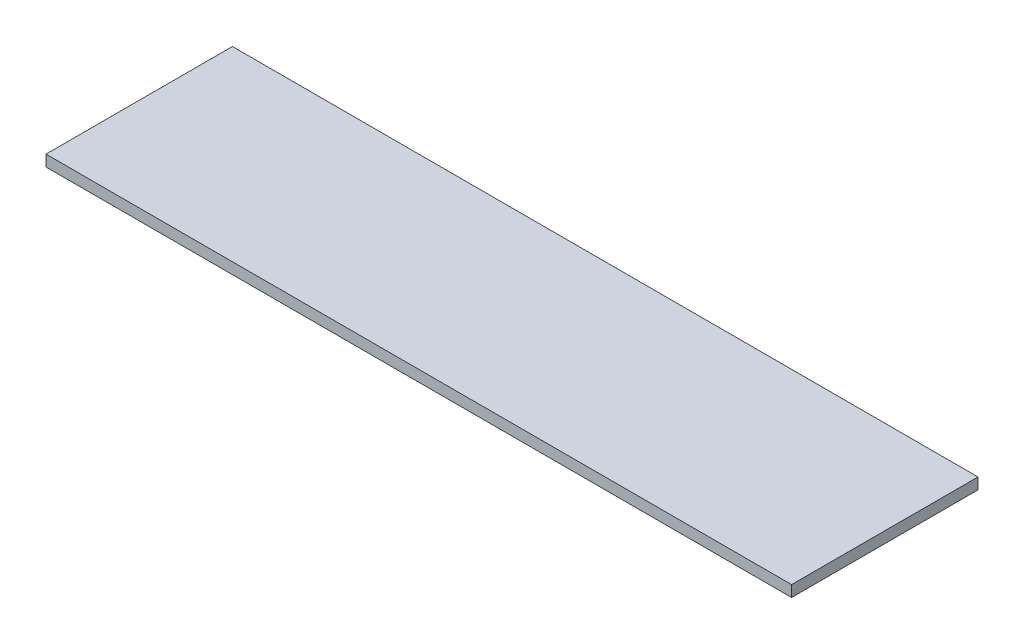
ISO-10303-21;
HEADER;
FILE_DESCRIPTION(('STEP AP214'),'2;1');
FILE_NAME('part.step','',(''),(''),'','','');
FILE_SCHEMA(('AUTOMOTIVE_DESIGN { 1 0 10303 214 1 1 1 1 }'));
ENDSEC;
DATA;
#1=APPLICATION_CONTEXT('core data for automotive mechanical design processes');
#2=APPLICATION_PROTOCOL_DEFINITION('international standard','automotive_design',2000,#1);
#3=PRODUCT_CONTEXT('',#1,'mechanical');
#4=PRODUCT('Part','Part','',(#3));
#5=PRODUCT_RELATED_PRODUCT_CATEGORY('part','',(#4));
#6=PRODUCT_DEFINITION_FORMATION('','',#4);
#7=PRODUCT_DEFINITION_CONTEXT('part definition',#1,'design');
#8=PRODUCT_DEFINITION('design','',#6,#7);
#9=PRODUCT_DEFINITION_SHAPE('','',#8);
#10=(LENGTH_UNIT() NAMED_UNIT(*) SI_UNIT(.MILLI.,.METRE.));
#11=(NAMED_UNIT(*) PLANE_ANGLE_UNIT() SI_UNIT($,.RADIAN.));
#12=(NAMED_UNIT(*) SI_UNIT($,.STERADIAN.) SOLID_ANGLE_UNIT());
#13=UNCERTAINTY_MEASURE_WITH_UNIT(LENGTH_MEASURE(1.E-05),#10,'distance_accuracy_value','');
#14=(GEOMETRIC_REPRESENTATION_CONTEXT(3) GLOBAL_UNCERTAINTY_ASSIGNED_CONTEXT((#13)) GLOBAL_UNIT_ASSIGNED_CONTEXT((#10,
#11,#12)) REPRESENTATION_CONTEXT('',''));
#15=CARTESIAN_POINT('',(0.,0.,0.));
#16=DIRECTION('',(0.,0.,1.));
#17=DIRECTION('',(1.,0.,0.));
#18=AXIS2_PLACEMENT_3D('',#15,#16,#17);
#19=CARTESIAN_POINT('',(100.,3.,-25.));
#20=DIRECTION('',(-1.,0.,0.));
#21=DIRECTION('',(0.,0.,1.));
#22=AXIS2_PLACEMENT_3D('',#19,#20,#21);
#23=PLANE('',#22);
#24=DIRECTION('',(0.,0.,-1.));
#25=VECTOR('',#24,1.);
#26=CARTESIAN_POINT('',(100.,0.,-25.));
#27=LINE('',#26,#25);
#28=CARTESIAN_POINT('',(100.,0.,25.));
#29=VERTEX_POINT('',#28);
#30=CARTESIAN_POINT('',(100.,0.,-25.));
#31=VERTEX_POINT('',#30);
#32=EDGE_CURVE('E107',#29,#31,#27,.T.);
#33=ORIENTED_EDGE('',*,*,#32,.T.);
#34=DIRECTION('',(0.,-1.,0.));
#35=VECTOR('',#34,1.);
#36=CARTESIAN_POINT('',(100.,3.,-25.));
#37=LINE('',#36,#35);
#38=CARTESIAN_POINT('',(100.,3.,-25.));
#39=VERTEX_POINT('',#38);
#40=EDGE_CURVE('E11',#39,#31,#37,.T.);
#41=ORIENTED_EDGE('',*,*,#40,.F.);
#42=DIRECTION('',(0.,0.,-1.));
#43=VECTOR('',#42,1.);
#44=CARTESIAN_POINT('',(100.,3.,-25.));
#45=LINE('',#44,#43);
#46=CARTESIAN_POINT('',(100.,3.,25.));
#47=VERTEX_POINT('',#46);
#48=EDGE_CURVE('E91',#47,#39,#45,.T.);
#49=ORIENTED_EDGE('',*,*,#48,.F.);
#50=DIRECTION('',(0.,-1.,0.));
#51=VECTOR('',#50,1.);
#52=CARTESIAN_POINT('',(100.,3.,25.));
#53=LINE('',#52,#51);
#54=EDGE_CURVE('E103',#47,#29,#53,.T.);
#55=ORIENTED_EDGE('',*,*,#54,.T.);
#56=EDGE_LOOP('',(#33,#41,#49,#55));
#57=FACE_BOUND('',#56,.T.);
#58=ADVANCED_FACE('F39',(#57),#23,.F.);
#59=CARTESIAN_POINT('',(-100.,3.,-25.));
#60=DIRECTION('',(0.,0.,1.));
#61=DIRECTION('',(1.,0.,0.));
#62=AXIS2_PLACEMENT_3D('',#59,#60,#61);
#63=PLANE('',#62);
#64=DIRECTION('',(-1.,0.,0.));
#65=VECTOR('',#64,1.);
#66=CARTESIAN_POINT('',(-100.,0.,-25.));
#67=LINE('',#66,#65);
#68=CARTESIAN_POINT('',(-100.,0.,-25.));
#69=VERTEX_POINT('',#68);
#70=EDGE_CURVE('E96',#31,#69,#67,.T.);
#71=ORIENTED_EDGE('',*,*,#70,.T.);
#72=DIRECTION('',(0.,-1.,0.));
#73=VECTOR('',#72,1.);
#74=CARTESIAN_POINT('',(-100.,3.,-25.));
#75=LINE('',#74,#73);
#76=CARTESIAN_POINT('',(-100.,3.,-25.));
#77=VERTEX_POINT('',#76);
#78=EDGE_CURVE('E48',#77,#69,#75,.T.);
#79=ORIENTED_EDGE('',*,*,#78,.F.);
#80=DIRECTION('',(-1.,0.,0.));
#81=VECTOR('',#80,1.);
#82=CARTESIAN_POINT('',(-100.,3.,-25.));
#83=LINE('',#82,#81);
#84=EDGE_CURVE('E86',#39,#77,#83,.T.);
#85=ORIENTED_EDGE('',*,*,#84,.F.);
#86=ORIENTED_EDGE('',*,*,#40,.T.);
#87=EDGE_LOOP('',(#71,#79,#85,#86));
#88=FACE_BOUND('',#87,.T.);
#89=ADVANCED_FACE('F95',(#88),#63,.F.);
#90=CARTESIAN_POINT('',(-100.,3.,-25.));
#91=DIRECTION('',(1.,0.,0.));
#92=DIRECTION('',(0.,0.,-1.));
#93=AXIS2_PLACEMENT_3D('',#90,#91,#92);
#94=PLANE('',#93);
#95=DIRECTION('',(0.,0.,1.));
#96=VECTOR('',#95,1.);
#97=CARTESIAN_POINT('',(-100.,0.,-25.));
#98=LINE('',#97,#96);
#99=CARTESIAN_POINT('',(-100.,0.,25.));
#100=VERTEX_POINT('',#99);
#101=EDGE_CURVE('E73',#69,#100,#98,.T.);
#102=ORIENTED_EDGE('',*,*,#101,.T.);
#103=DIRECTION('',(0.,-1.,0.));
#104=VECTOR('',#103,1.);
#105=CARTESIAN_POINT('',(-100.,3.,25.));
#106=LINE('',#105,#104);
#107=CARTESIAN_POINT('',(-100.,3.,25.));
#108=VERTEX_POINT('',#107);
#109=EDGE_CURVE('E98',#108,#100,#106,.T.);
#110=ORIENTED_EDGE('',*,*,#109,.F.);
#111=DIRECTION('',(0.,0.,1.));
#112=VECTOR('',#111,1.);
#113=CARTESIAN_POINT('',(-100.,3.,-25.));
#114=LINE('',#113,#112);
#115=EDGE_CURVE('E89',#77,#108,#114,.T.);
#116=ORIENTED_EDGE('',*,*,#115,.F.);
#117=ORIENTED_EDGE('',*,*,#78,.T.);
#118=EDGE_LOOP('',(#102,#110,#116,#117));
#119=FACE_BOUND('',#118,.T.);
#120=ADVANCED_FACE('F99',(#119),#94,.F.);
#121=CARTESIAN_POINT('',(-100.,3.,25.));
#122=DIRECTION('',(0.,0.,-1.));
#123=DIRECTION('',(-1.,0.,0.));
#124=AXIS2_PLACEMENT_3D('',#121,#122,#123);
#125=PLANE('',#124);
#126=DIRECTION('',(1.,0.,0.));
#127=VECTOR('',#126,1.);
#128=CARTESIAN_POINT('',(-100.,0.,25.));
#129=LINE('',#128,#127);
#130=EDGE_CURVE('E79',#100,#29,#129,.T.);
#131=ORIENTED_EDGE('',*,*,#130,.T.);
#132=ORIENTED_EDGE('',*,*,#54,.F.);
#133=DIRECTION('',(1.,0.,0.));
#134=VECTOR('',#133,1.);
#135=CARTESIAN_POINT('',(-100.,3.,25.));
#136=LINE('',#135,#134);
#137=EDGE_CURVE('E56',#108,#47,#136,.T.);
#138=ORIENTED_EDGE('',*,*,#137,.F.);
#139=ORIENTED_EDGE('',*,*,#109,.T.);
#140=EDGE_LOOP('',(#131,#132,#138,#139));
#141=FACE_BOUND('',#140,.T.);
#142=ADVANCED_FACE('F120',(#141),#125,.F.);
#143=CARTESIAN_POINT('',(0.,3.,0.));
#144=DIRECTION('',(0.,1.,0.));
#145=DIRECTION('',(0.,0.,1.));
#146=AXIS2_PLACEMENT_3D('',#143,#144,#145);
#147=PLANE('',#146);
#148=ORIENTED_EDGE('',*,*,#48,.T.);
#149=ORIENTED_EDGE('',*,*,#84,.T.);
#150=ORIENTED_EDGE('',*,*,#115,.T.);
#151=ORIENTED_EDGE('',*,*,#137,.T.);
#152=EDGE_LOOP('',(#148,#149,#150,#151));
#153=FACE_BOUND('',#152,.T.);
#154=ADVANCED_FACE('F87',(#153),#147,.T.);
#155=CARTESIAN_POINT('',(0.,0.,0.));
#156=DIRECTION('',(0.,1.,0.));
#157=DIRECTION('',(0.,0.,1.));
#158=AXIS2_PLACEMENT_3D('',#155,#156,#157);
#159=PLANE('',#158);
#160=ORIENTED_EDGE('',*,*,#32,.F.);
#161=ORIENTED_EDGE('',*,*,#130,.F.);
#162=ORIENTED_EDGE('',*,*,#101,.F.);
#163=ORIENTED_EDGE('',*,*,#70,.F.);
#164=EDGE_LOOP('',(#160,#161,#162,#163));
#165=FACE_BOUND('',#164,.T.);
#166=ADVANCED_FACE('F123',(#165),#159,.F.);
#167=CLOSED_SHELL('',(#58,#89,#120,#142,#154,#166));
#168=MANIFOLD_SOLID_BREP('B2',#167);
#169=ADVANCED_BREP_SHAPE_REPRESENTATION('',(#18,#168),#14);
#170=SHAPE_DEFINITION_REPRESENTATION(#9,#169);
ENDSEC;
END-ISO-10303-21;
